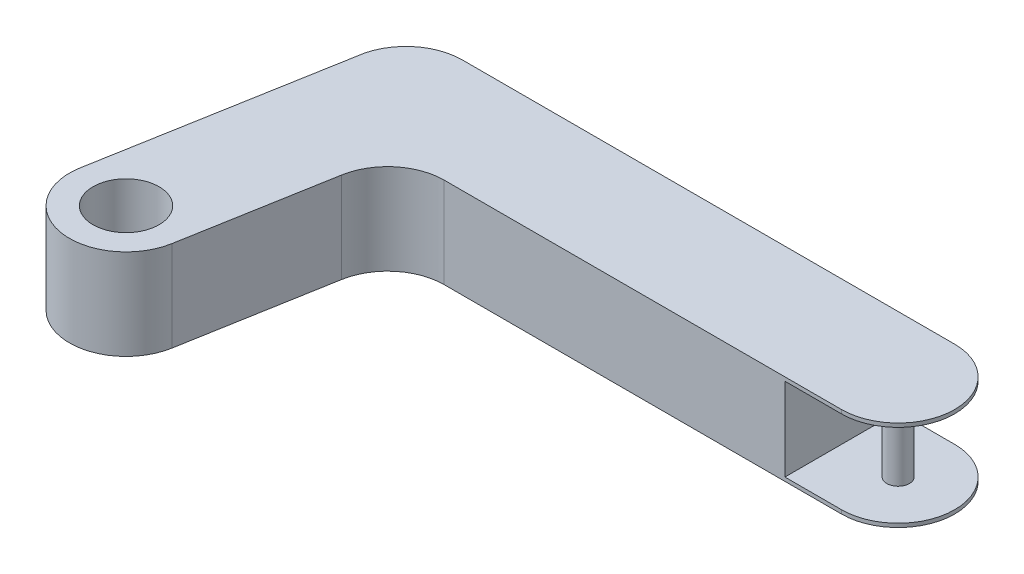
ISO-10303-21;
HEADER;
FILE_DESCRIPTION(('STEP AP214'),'2;1');
FILE_NAME('part.step','',(''),(''),'','','');
FILE_SCHEMA(('AUTOMOTIVE_DESIGN { 1 0 10303 214 1 1 1 1 }'));
ENDSEC;
DATA;
#1=APPLICATION_CONTEXT('core data for automotive mechanical design processes');
#2=APPLICATION_PROTOCOL_DEFINITION('international standard','automotive_design',2000,#1);
#3=PRODUCT_CONTEXT('',#1,'mechanical');
#4=PRODUCT('Part','Part','',(#3));
#5=PRODUCT_RELATED_PRODUCT_CATEGORY('part','',(#4));
#6=PRODUCT_DEFINITION_FORMATION('','',#4);
#7=PRODUCT_DEFINITION_CONTEXT('part definition',#1,'design');
#8=PRODUCT_DEFINITION('design','',#6,#7);
#9=PRODUCT_DEFINITION_SHAPE('','',#8);
#10=(LENGTH_UNIT() NAMED_UNIT(*) SI_UNIT(.MILLI.,.METRE.));
#11=(NAMED_UNIT(*) PLANE_ANGLE_UNIT() SI_UNIT($,.RADIAN.));
#12=(NAMED_UNIT(*) SI_UNIT($,.STERADIAN.) SOLID_ANGLE_UNIT());
#13=UNCERTAINTY_MEASURE_WITH_UNIT(LENGTH_MEASURE(1.E-05),#10,'distance_accuracy_value','');
#14=(GEOMETRIC_REPRESENTATION_CONTEXT(3) GLOBAL_UNCERTAINTY_ASSIGNED_CONTEXT((#13)) GLOBAL_UNIT_ASSIGNED_CONTEXT((#10,
#11,#12)) REPRESENTATION_CONTEXT('',''));
#15=CARTESIAN_POINT('',(0.,0.,0.));
#16=DIRECTION('',(0.,0.,1.));
#17=DIRECTION('',(1.,0.,0.));
#18=AXIS2_PLACEMENT_3D('',#15,#16,#17);
#19=CARTESIAN_POINT('',(359.662846673892,-30.48,-160.132216378943));
#20=DIRECTION('',(0.,1.,0.));
#21=DIRECTION('',(0.,0.,1.));
#22=AXIS2_PLACEMENT_3D('',#19,#20,#21);
#23=CYLINDRICAL_SURFACE('',#22,38.1);
#24=CARTESIAN_POINT('',(359.662846673892,-27.94,-160.132216378943));
#25=DIRECTION('',(0.,-1.,0.));
#26=DIRECTION('',(1.,0.,0.));
#27=AXIS2_PLACEMENT_3D('',#24,#25,#26);
#28=CIRCLE('',#27,38.1);
#29=CARTESIAN_POINT('',(359.662846673892,-27.94,-122.032216378943));
#30=VERTEX_POINT('',#29);
#31=CARTESIAN_POINT('',(359.662846673892,-27.94,-198.232216378943));
#32=VERTEX_POINT('',#31);
#33=EDGE_CURVE('E161',#30,#32,#28,.F.);
#34=ORIENTED_EDGE('',*,*,#33,.F.);
#35=DIRECTION('',(0.,1.,0.));
#36=VECTOR('',#35,1.);
#37=CARTESIAN_POINT('',(359.662846673892,-30.48,-122.032216378943));
#38=LINE('',#37,#36);
#39=CARTESIAN_POINT('',(359.662846673892,-30.48,-122.032216378943));
#40=VERTEX_POINT('',#39);
#41=EDGE_CURVE('E148',#40,#30,#38,.T.);
#42=ORIENTED_EDGE('',*,*,#41,.F.);
#43=CARTESIAN_POINT('',(359.662846673892,-30.48,-160.132216378943));
#44=DIRECTION('',(0.,1.,0.));
#45=DIRECTION('',(0.,0.,1.));
#46=AXIS2_PLACEMENT_3D('',#43,#44,#45);
#47=CIRCLE('',#46,38.1);
#48=CARTESIAN_POINT('',(359.662846673892,-30.48,-198.232216378943));
#49=VERTEX_POINT('',#48);
#50=EDGE_CURVE('E197',#40,#49,#47,.T.);
#51=ORIENTED_EDGE('',*,*,#50,.T.);
#52=DIRECTION('',(0.,1.,0.));
#53=VECTOR('',#52,1.);
#54=CARTESIAN_POINT('',(359.662846673892,-30.48,-198.232216378943));
#55=LINE('',#54,#53);
#56=EDGE_CURVE('E223',#49,#32,#55,.T.);
#57=ORIENTED_EDGE('',*,*,#56,.T.);
#58=EDGE_LOOP('',(#34,#42,#51,#57));
#59=FACE_BOUND('',#58,.T.);
#60=ADVANCED_FACE('F36',(#59),#23,.T.);
#61=CARTESIAN_POINT('',(92.1750221239627,-30.48,-83.9322163789429));
#62=DIRECTION('',(0.,1.,0.));
#63=DIRECTION('',(0.,0.,1.));
#64=AXIS2_PLACEMENT_3D('',#61,#62,#63);
#65=CYLINDRICAL_SURFACE('',#64,38.1);
#66=DIRECTION('',(0.,1.,0.));
#67=VECTOR('',#66,1.);
#68=CARTESIAN_POINT('',(92.1750221239627,-30.48,-122.032216378943));
#69=LINE('',#68,#67);
#70=CARTESIAN_POINT('',(92.1750221239627,-30.48,-122.032216378943));
#71=VERTEX_POINT('',#70);
#72=CARTESIAN_POINT('',(92.1750221239627,30.48,-122.032216378943));
#73=VERTEX_POINT('',#72);
#74=EDGE_CURVE('E214',#71,#73,#69,.T.);
#75=ORIENTED_EDGE('',*,*,#74,.T.);
#76=CARTESIAN_POINT('',(92.1750221239627,30.48,-83.9322163789429));
#77=DIRECTION('',(0.,-1.,0.));
#78=DIRECTION('',(0.,0.,1.));
#79=AXIS2_PLACEMENT_3D('',#76,#77,#78);
#80=CIRCLE('',#79,38.1);
#81=CARTESIAN_POINT('',(54.6538467341976,30.48,-90.5482119480531));
#82=VERTEX_POINT('',#81);
#83=EDGE_CURVE('E166',#82,#73,#80,.T.);
#84=ORIENTED_EDGE('',*,*,#83,.F.);
#85=DIRECTION('',(0.,1.,0.));
#86=VECTOR('',#85,1.);
#87=CARTESIAN_POINT('',(54.6538467341976,-30.48,-90.5482119480531));
#88=LINE('',#87,#86);
#89=CARTESIAN_POINT('',(54.6538467341976,-30.48,-90.5482119480531));
#90=VERTEX_POINT('',#89);
#91=EDGE_CURVE('E11',#90,#82,#88,.T.);
#92=ORIENTED_EDGE('',*,*,#91,.F.);
#93=CARTESIAN_POINT('',(92.1750221239627,-30.48,-83.9322163789429));
#94=DIRECTION('',(0.,-1.,0.));
#95=DIRECTION('',(0.,0.,1.));
#96=AXIS2_PLACEMENT_3D('',#93,#94,#95);
#97=CIRCLE('',#96,38.1);
#98=EDGE_CURVE('E193',#90,#71,#97,.T.);
#99=ORIENTED_EDGE('',*,*,#98,.T.);
#100=EDGE_LOOP('',(#75,#84,#92,#99));
#101=FACE_BOUND('',#100,.T.);
#102=ADVANCED_FACE('F38',(#101),#65,.F.);
#103=CARTESIAN_POINT('',(37.5211753897651,-30.48,6.6159955691102));
#104=DIRECTION('',(0.984807753012207,0.,0.173648177666934));
#105=DIRECTION('',(0.173648177666934,0.,-0.984807753012207));
#106=AXIS2_PLACEMENT_3D('',#103,#104,#105);
#107=PLANE('',#106);
#108=ORIENTED_EDGE('',*,*,#91,.T.);
#109=DIRECTION('',(0.173648177666934,0.,-0.984807753012207));
#110=VECTOR('',#109,1.);
#111=CARTESIAN_POINT('',(37.5211753897651,30.48,6.6159955691102));
#112=LINE('',#111,#110);
#113=CARTESIAN_POINT('',(37.5211753897651,30.48,6.61599556911017));
#114=VERTEX_POINT('',#113);
#115=EDGE_CURVE('E187',#114,#82,#112,.T.);
#116=ORIENTED_EDGE('',*,*,#115,.F.);
#117=DIRECTION('',(0.,1.,0.));
#118=VECTOR('',#117,1.);
#119=CARTESIAN_POINT('',(37.5211753897651,-30.48,6.61599556911017));
#120=LINE('',#119,#118);
#121=CARTESIAN_POINT('',(37.5211753897651,-30.48,6.61599556911017));
#122=VERTEX_POINT('',#121);
#123=EDGE_CURVE('E45',#122,#114,#120,.T.);
#124=ORIENTED_EDGE('',*,*,#123,.F.);
#125=DIRECTION('',(0.173648177666934,0.,-0.984807753012207));
#126=VECTOR('',#125,1.);
#127=CARTESIAN_POINT('',(37.5211753897651,-30.48,6.6159955691102));
#128=LINE('',#127,#126);
#129=EDGE_CURVE('E212',#122,#90,#128,.T.);
#130=ORIENTED_EDGE('',*,*,#129,.T.);
#131=EDGE_LOOP('',(#108,#116,#124,#130));
#132=FACE_BOUND('',#131,.T.);
#133=ADVANCED_FACE('F253',(#132),#107,.T.);
#134=CARTESIAN_POINT('',(0.,-30.48,0.));
#135=DIRECTION('',(0.,1.,0.));
#136=DIRECTION('',(0.,0.,1.));
#137=AXIS2_PLACEMENT_3D('',#134,#135,#136);
#138=CYLINDRICAL_SURFACE('',#137,38.1);
#139=ORIENTED_EDGE('',*,*,#123,.T.);
#140=CARTESIAN_POINT('',(0.,30.48,0.));
#141=DIRECTION('',(0.,1.,0.));
#142=DIRECTION('',(0.,0.,1.));
#143=AXIS2_PLACEMENT_3D('',#140,#141,#142);
#144=CIRCLE('',#143,38.1);
#145=CARTESIAN_POINT('',(-37.516563910054,30.48,-6.64209548130927));
#146=VERTEX_POINT('',#145);
#147=EDGE_CURVE('E184',#146,#114,#144,.T.);
#148=ORIENTED_EDGE('',*,*,#147,.F.);
#149=DIRECTION('',(0.,1.,0.));
#150=VECTOR('',#149,1.);
#151=CARTESIAN_POINT('',(-37.516563910054,-30.48,-6.64209548130927));
#152=LINE('',#151,#150);
#153=CARTESIAN_POINT('',(-37.516563910054,-30.48,-6.64209548130927));
#154=VERTEX_POINT('',#153);
#155=EDGE_CURVE('E217',#154,#146,#152,.T.);
#156=ORIENTED_EDGE('',*,*,#155,.F.);
#157=CARTESIAN_POINT('',(0.,-30.48,0.));
#158=DIRECTION('',(0.,1.,0.));
#159=DIRECTION('',(0.,0.,1.));
#160=AXIS2_PLACEMENT_3D('',#157,#158,#159);
#161=CIRCLE('',#160,38.1);
#162=EDGE_CURVE('E209',#154,#122,#161,.T.);
#163=ORIENTED_EDGE('',*,*,#162,.T.);
#164=EDGE_LOOP('',(#139,#148,#156,#163));
#165=FACE_BOUND('',#164,.T.);
#166=ADVANCED_FACE('F283',(#165),#138,.T.);
#167=CARTESIAN_POINT('',(-37.516563910054,-30.48,-6.64209548130927));
#168=DIRECTION('',(-0.984686716799319,0.,-0.174333214732527));
#169=DIRECTION('',(-0.174333214732527,0.,0.984686716799319));
#170=AXIS2_PLACEMENT_3D('',#167,#168,#169);
#171=PLANE('',#170);
#172=ORIENTED_EDGE('',*,*,#155,.T.);
#173=DIRECTION('',(-0.174333214732527,0.,0.984686716799319));
#174=VECTOR('',#173,1.);
#175=CARTESIAN_POINT('',(-37.516563910054,30.48,-6.64209548130927));
#176=LINE('',#175,#174);
#177=CARTESIAN_POINT('',(-8.65811343549267,30.48,-169.643350826196));
#178=VERTEX_POINT('',#177);
#179=EDGE_CURVE('E181',#178,#146,#176,.T.);
#180=ORIENTED_EDGE('',*,*,#179,.F.);
#181=DIRECTION('',(0.,1.,0.));
#182=VECTOR('',#181,1.);
#183=CARTESIAN_POINT('',(-8.65811343549267,-30.48,-169.643350826196));
#184=LINE('',#183,#182);
#185=CARTESIAN_POINT('',(-8.65811343549267,-30.48,-169.643350826196));
#186=VERTEX_POINT('',#185);
#187=EDGE_CURVE('E219',#186,#178,#184,.T.);
#188=ORIENTED_EDGE('',*,*,#187,.F.);
#189=DIRECTION('',(-0.174333214732527,0.,0.984686716799319));
#190=VECTOR('',#189,1.);
#191=CARTESIAN_POINT('',(-37.516563910054,-30.48,-6.64209548130927));
#192=LINE('',#191,#190);
#193=EDGE_CURVE('E206',#186,#154,#192,.T.);
#194=ORIENTED_EDGE('',*,*,#193,.T.);
#195=EDGE_LOOP('',(#172,#180,#188,#194));
#196=FACE_BOUND('',#195,.T.);
#197=ADVANCED_FACE('F277',(#196),#171,.T.);
#198=CARTESIAN_POINT('',(28.2356302282543,-30.48,-160.132216378943));
#199=DIRECTION('',(0.,1.,0.));
#200=DIRECTION('',(0.,0.,1.));
#201=AXIS2_PLACEMENT_3D('',#198,#199,#200);
#202=CYLINDRICAL_SURFACE('',#201,38.0999999999999);
#203=ORIENTED_EDGE('',*,*,#187,.T.);
#204=CARTESIAN_POINT('',(28.2356302282543,30.48,-160.132216378943));
#205=DIRECTION('',(0.,1.,0.));
#206=DIRECTION('',(0.,0.,1.));
#207=AXIS2_PLACEMENT_3D('',#204,#205,#206);
#208=CIRCLE('',#207,38.0999999999999);
#209=CARTESIAN_POINT('',(28.2356302282543,30.48,-198.232216378943));
#210=VERTEX_POINT('',#209);
#211=EDGE_CURVE('E178',#210,#178,#208,.T.);
#212=ORIENTED_EDGE('',*,*,#211,.F.);
#213=DIRECTION('',(0.,1.,0.));
#214=VECTOR('',#213,1.);
#215=CARTESIAN_POINT('',(28.2356302282543,-30.48,-198.232216378943));
#216=LINE('',#215,#214);
#217=CARTESIAN_POINT('',(28.2356302282543,-30.48,-198.232216378943));
#218=VERTEX_POINT('',#217);
#219=EDGE_CURVE('E221',#218,#210,#216,.T.);
#220=ORIENTED_EDGE('',*,*,#219,.F.);
#221=CARTESIAN_POINT('',(28.2356302282543,-30.48,-160.132216378943));
#222=DIRECTION('',(0.,1.,0.));
#223=DIRECTION('',(0.,0.,1.));
#224=AXIS2_PLACEMENT_3D('',#221,#222,#223);
#225=CIRCLE('',#224,38.0999999999999);
#226=EDGE_CURVE('E203',#218,#186,#225,.T.);
#227=ORIENTED_EDGE('',*,*,#226,.T.);
#228=EDGE_LOOP('',(#203,#212,#220,#227));
#229=FACE_BOUND('',#228,.T.);
#230=ADVANCED_FACE('F263',(#229),#202,.T.);
#231=CARTESIAN_POINT('',(359.662846673892,-30.48,-198.232216378943));
#232=DIRECTION('',(0.,0.,-1.));
#233=DIRECTION('',(-1.,0.,0.));
#234=AXIS2_PLACEMENT_3D('',#231,#232,#233);
#235=PLANE('',#234);
#236=DIRECTION('',(-1.,0.,0.));
#237=VECTOR('',#236,1.);
#238=CARTESIAN_POINT('',(321.562846673892,-27.94,-198.232216378943));
#239=LINE('',#238,#237);
#240=CARTESIAN_POINT('',(321.562846673892,-27.94,-198.232216378943));
#241=VERTEX_POINT('',#240);
#242=EDGE_CURVE('E144',#32,#241,#239,.T.);
#243=ORIENTED_EDGE('',*,*,#242,.F.);
#244=ORIENTED_EDGE('',*,*,#56,.F.);
#245=DIRECTION('',(-1.,0.,0.));
#246=VECTOR('',#245,1.);
#247=CARTESIAN_POINT('',(359.662846673892,-30.48,-198.232216378943));
#248=LINE('',#247,#246);
#249=EDGE_CURVE('E200',#49,#218,#248,.T.);
#250=ORIENTED_EDGE('',*,*,#249,.T.);
#251=ORIENTED_EDGE('',*,*,#219,.T.);
#252=DIRECTION('',(-1.,0.,0.));
#253=VECTOR('',#252,1.);
#254=CARTESIAN_POINT('',(359.662846673892,30.48,-198.232216378943));
#255=LINE('',#254,#253);
#256=CARTESIAN_POINT('',(359.662846673892,30.48,-198.232216378943));
#257=VERTEX_POINT('',#256);
#258=EDGE_CURVE('E175',#257,#210,#255,.T.);
#259=ORIENTED_EDGE('',*,*,#258,.F.);
#260=CARTESIAN_POINT('',(359.662846673892,27.94,-198.232216378943));
#261=VERTEX_POINT('',#260);
#262=EDGE_CURVE('E226',#261,#257,#55,.T.);
#263=ORIENTED_EDGE('',*,*,#262,.F.);
#264=DIRECTION('',(1.,0.,0.));
#265=VECTOR('',#264,1.);
#266=CARTESIAN_POINT('',(397.762846673892,27.94,-198.232216378943));
#267=LINE('',#266,#265);
#268=CARTESIAN_POINT('',(321.562846673892,27.94,-198.232216378943));
#269=VERTEX_POINT('',#268);
#270=EDGE_CURVE('E149',#269,#261,#267,.T.);
#271=ORIENTED_EDGE('',*,*,#270,.F.);
#272=DIRECTION('',(0.,1.,0.));
#273=VECTOR('',#272,1.);
#274=CARTESIAN_POINT('',(321.562846673892,27.94,-198.232216378943));
#275=LINE('',#274,#273);
#276=EDGE_CURVE('E151',#241,#269,#275,.T.);
#277=ORIENTED_EDGE('',*,*,#276,.F.);
#278=EDGE_LOOP('',(#243,#244,#250,#251,#259,#263,#271,#277));
#279=FACE_BOUND('',#278,.T.);
#280=ADVANCED_FACE('F256',(#279),#235,.T.);
#281=CARTESIAN_POINT('',(359.662846673892,27.94,-160.132216378943));
#282=DIRECTION('',(0.,1.,0.));
#283=DIRECTION('',(0.,0.,1.));
#284=AXIS2_PLACEMENT_3D('',#281,#282,#283);
#285=CIRCLE('',#284,38.1);
#286=CARTESIAN_POINT('',(359.662846673892,27.94,-122.032216378943));
#287=VERTEX_POINT('',#286);
#288=EDGE_CURVE('E53',#261,#287,#285,.F.);
#289=ORIENTED_EDGE('',*,*,#288,.F.);
#290=ORIENTED_EDGE('',*,*,#262,.T.);
#291=CARTESIAN_POINT('',(359.662846673892,30.48,-160.132216378943));
#292=DIRECTION('',(0.,1.,0.));
#293=DIRECTION('',(0.,0.,1.));
#294=AXIS2_PLACEMENT_3D('',#291,#292,#293);
#295=CIRCLE('',#294,38.1);
#296=CARTESIAN_POINT('',(359.662846673892,30.48,-122.032216378943));
#297=VERTEX_POINT('',#296);
#298=EDGE_CURVE('E172',#297,#257,#295,.T.);
#299=ORIENTED_EDGE('',*,*,#298,.F.);
#300=EDGE_CURVE('E228',#287,#297,#38,.T.);
#301=ORIENTED_EDGE('',*,*,#300,.F.);
#302=EDGE_LOOP('',(#289,#290,#299,#301));
#303=FACE_BOUND('',#302,.T.);
#304=ADVANCED_FACE('F249',(#303),#23,.T.);
#305=CARTESIAN_POINT('',(359.662846673892,-30.48,-122.032216378943));
#306=DIRECTION('',(0.,0.,1.));
#307=DIRECTION('',(1.,0.,0.));
#308=AXIS2_PLACEMENT_3D('',#305,#306,#307);
#309=PLANE('',#308);
#310=DIRECTION('',(-1.,0.,0.));
#311=VECTOR('',#310,1.);
#312=CARTESIAN_POINT('',(321.562846673892,-27.94,-122.032216378943));
#313=LINE('',#312,#311);
#314=CARTESIAN_POINT('',(321.562846673892,-27.94,-122.032216378943));
#315=VERTEX_POINT('',#314);
#316=EDGE_CURVE('E141',#30,#315,#313,.T.);
#317=ORIENTED_EDGE('',*,*,#316,.T.);
#318=DIRECTION('',(0.,1.,0.));
#319=VECTOR('',#318,1.);
#320=CARTESIAN_POINT('',(321.562846673892,27.94,-122.032216378943));
#321=LINE('',#320,#319);
#322=CARTESIAN_POINT('',(321.562846673892,27.94,-122.032216378943));
#323=VERTEX_POINT('',#322);
#324=EDGE_CURVE('E127',#315,#323,#321,.T.);
#325=ORIENTED_EDGE('',*,*,#324,.T.);
#326=DIRECTION('',(1.,0.,0.));
#327=VECTOR('',#326,1.);
#328=CARTESIAN_POINT('',(397.762846673892,27.94,-122.032216378943));
#329=LINE('',#328,#327);
#330=EDGE_CURVE('E156',#323,#287,#329,.T.);
#331=ORIENTED_EDGE('',*,*,#330,.T.);
#332=ORIENTED_EDGE('',*,*,#300,.T.);
#333=DIRECTION('',(1.,0.,0.));
#334=VECTOR('',#333,1.);
#335=CARTESIAN_POINT('',(359.662846673892,30.48,-122.032216378943));
#336=LINE('',#335,#334);
#337=EDGE_CURVE('E169',#73,#297,#336,.T.);
#338=ORIENTED_EDGE('',*,*,#337,.F.);
#339=ORIENTED_EDGE('',*,*,#74,.F.);
#340=DIRECTION('',(1.,0.,0.));
#341=VECTOR('',#340,1.);
#342=CARTESIAN_POINT('',(359.662846673892,-30.48,-122.032216378943));
#343=LINE('',#342,#341);
#344=EDGE_CURVE('E195',#71,#40,#343,.T.);
#345=ORIENTED_EDGE('',*,*,#344,.T.);
#346=ORIENTED_EDGE('',*,*,#41,.T.);
#347=EDGE_LOOP('',(#317,#325,#331,#332,#338,#339,#345,#346));
#348=FACE_BOUND('',#347,.T.);
#349=ADVANCED_FACE('F146',(#348),#309,.T.);
#350=CARTESIAN_POINT('',(92.1750221239627,-30.48,-83.9322163789429));
#351=DIRECTION('',(0.,1.,0.));
#352=DIRECTION('',(0.,0.,1.));
#353=AXIS2_PLACEMENT_3D('',#350,#351,#352);
#354=PLANE('',#353);
#355=CARTESIAN_POINT('',(0.,-30.48,0.));
#356=DIRECTION('',(0.,1.,0.));
#357=DIRECTION('',(0.,0.,1.));
#358=AXIS2_PLACEMENT_3D('',#355,#356,#357);
#359=CIRCLE('',#358,22.225);
#360=CARTESIAN_POINT('',(0.,-30.48,22.225));
#361=VERTEX_POINT('',#360);
#362=EDGE_CURVE('E190',#361,#361,#359,.T.);
#363=ORIENTED_EDGE('',*,*,#362,.T.);
#364=EDGE_LOOP('',(#363));
#365=FACE_BOUND('',#364,.T.);
#366=ORIENTED_EDGE('',*,*,#98,.F.);
#367=ORIENTED_EDGE('',*,*,#129,.F.);
#368=ORIENTED_EDGE('',*,*,#162,.F.);
#369=ORIENTED_EDGE('',*,*,#193,.F.);
#370=ORIENTED_EDGE('',*,*,#226,.F.);
#371=ORIENTED_EDGE('',*,*,#249,.F.);
#372=ORIENTED_EDGE('',*,*,#50,.F.);
#373=ORIENTED_EDGE('',*,*,#344,.F.);
#374=EDGE_LOOP('',(#366,#367,#368,#369,#370,#371,#372,#373));
#375=FACE_BOUND('',#374,.T.);
#376=ADVANCED_FACE('F262',(#365,#375),#354,.F.);
#377=CARTESIAN_POINT('',(0.,-30.48,0.));
#378=DIRECTION('',(0.,1.,0.));
#379=DIRECTION('',(0.,0.,1.));
#380=AXIS2_PLACEMENT_3D('',#377,#378,#379);
#381=CYLINDRICAL_SURFACE('',#380,22.225);
#382=CARTESIAN_POINT('',(0.,30.48,0.));
#383=DIRECTION('',(0.,1.,0.));
#384=DIRECTION('',(0.,0.,1.));
#385=AXIS2_PLACEMENT_3D('',#382,#383,#384);
#386=CIRCLE('',#385,22.225);
#387=CARTESIAN_POINT('',(0.,30.48,22.225));
#388=VERTEX_POINT('',#387);
#389=EDGE_CURVE('E163',#388,#388,#386,.T.);
#390=CARTESIAN_POINT('',(0.,-30.48,22.225));
#391=CARTESIAN_POINT('',(0.,-29.845,22.225));
#392=CARTESIAN_POINT('',(0.,-29.21,22.225));
#393=CARTESIAN_POINT('',(0.,-27.94,22.225));
#394=CARTESIAN_POINT('',(0.,-27.305,22.225));
#395=CARTESIAN_POINT('',(0.,-26.035,22.225));
#396=CARTESIAN_POINT('',(0.,-25.4,22.225));
#397=CARTESIAN_POINT('',(0.,-24.13,22.225));
#398=CARTESIAN_POINT('',(0.,-23.495,22.225));
#399=CARTESIAN_POINT('',(0.,-22.225,22.225));
#400=CARTESIAN_POINT('',(0.,-21.59,22.225));
#401=CARTESIAN_POINT('',(0.,-20.32,22.225));
#402=CARTESIAN_POINT('',(0.,-19.685,22.225));
#403=CARTESIAN_POINT('',(0.,-18.415,22.225));
#404=CARTESIAN_POINT('',(0.,-17.78,22.225));
#405=CARTESIAN_POINT('',(0.,-16.51,22.225));
#406=CARTESIAN_POINT('',(0.,-15.875,22.225));
#407=CARTESIAN_POINT('',(0.,-14.605,22.225));
#408=CARTESIAN_POINT('',(0.,-13.97,22.225));
#409=CARTESIAN_POINT('',(0.,-12.7,22.225));
#410=CARTESIAN_POINT('',(0.,-12.065,22.225));
#411=CARTESIAN_POINT('',(0.,-10.795,22.225));
#412=CARTESIAN_POINT('',(0.,-10.16,22.225));
#413=CARTESIAN_POINT('',(0.,-8.89,22.225));
#414=CARTESIAN_POINT('',(0.,-8.255,22.225));
#415=CARTESIAN_POINT('',(0.,-6.985,22.225));
#416=CARTESIAN_POINT('',(0.,-6.35,22.225));
#417=CARTESIAN_POINT('',(0.,-5.08,22.225));
#418=CARTESIAN_POINT('',(0.,-4.445,22.225));
#419=CARTESIAN_POINT('',(0.,-3.175,22.225));
#420=CARTESIAN_POINT('',(0.,-2.54,22.225));
#421=CARTESIAN_POINT('',(0.,-1.27,22.225));
#422=CARTESIAN_POINT('',(0.,-0.635,22.225));
#423=CARTESIAN_POINT('',(0.,0.634999999999998,22.225));
#424=CARTESIAN_POINT('',(0.,1.27,22.225));
#425=CARTESIAN_POINT('',(0.,2.54,22.225));
#426=CARTESIAN_POINT('',(0.,3.175,22.225));
#427=CARTESIAN_POINT('',(0.,4.445,22.225));
#428=CARTESIAN_POINT('',(0.,5.07999999999999,22.225));
#429=CARTESIAN_POINT('',(0.,6.35,22.225));
#430=CARTESIAN_POINT('',(0.,6.985,22.225));
#431=CARTESIAN_POINT('',(0.,8.255,22.225));
#432=CARTESIAN_POINT('',(0.,8.89,22.225));
#433=CARTESIAN_POINT('',(0.,10.16,22.225));
#434=CARTESIAN_POINT('',(0.,10.795,22.225));
#435=CARTESIAN_POINT('',(0.,12.065,22.225));
#436=CARTESIAN_POINT('',(0.,12.7,22.225));
#437=CARTESIAN_POINT('',(0.,13.97,22.225));
#438=CARTESIAN_POINT('',(0.,14.605,22.225));
#439=CARTESIAN_POINT('',(0.,15.875,22.225));
#440=CARTESIAN_POINT('',(0.,16.51,22.225));
#441=CARTESIAN_POINT('',(0.,17.78,22.225));
#442=CARTESIAN_POINT('',(0.,18.415,22.225));
#443=CARTESIAN_POINT('',(0.,19.685,22.225));
#444=CARTESIAN_POINT('',(0.,20.32,22.225));
#445=CARTESIAN_POINT('',(0.,21.59,22.225));
#446=CARTESIAN_POINT('',(0.,22.225,22.225));
#447=CARTESIAN_POINT('',(0.,23.495,22.225));
#448=CARTESIAN_POINT('',(0.,24.13,22.225));
#449=CARTESIAN_POINT('',(0.,25.4,22.225));
#450=CARTESIAN_POINT('',(0.,26.035,22.225));
#451=CARTESIAN_POINT('',(0.,27.305,22.225));
#452=CARTESIAN_POINT('',(0.,27.94,22.225));
#453=CARTESIAN_POINT('',(0.,29.21,22.225));
#454=CARTESIAN_POINT('',(0.,29.845,22.225));
#455=CARTESIAN_POINT('',(0.,30.48,22.225));
#456=B_SPLINE_CURVE_WITH_KNOTS('',3,(#390,#391,#392,#393,#394,#395,#396,#397,#398,#399,#400,
#401,#402,#403,#404,#405,#406,#407,#408,#409,#410,#411,#412,#413,#414,#415,#416,#417,#418,#419,
#420,#421,#422,#423,#424,#425,#426,#427,#428,#429,#430,#431,#432,#433,#434,#435,#436,#437,#438,
#439,#440,#441,#442,#443,#444,#445,#446,#447,#448,#449,#450,#451,#452,#453,#454,#455),
.UNSPECIFIED.,.F.,.F.,(4,2,2,2,2,2,2,2,2,2,2,2,2,2,2,2,2,2,2,2,2,2,2,2,2,2,2,2,2,2,2,2,4),(0.,
1.905,3.81,5.715,7.62,9.525,11.43,13.335,15.24,17.145,19.05,20.955,22.86,24.765,26.67,28.575,
30.48,32.385,34.29,36.195,38.1,40.005,41.91,43.815,45.72,47.625,49.53,51.435,53.34,55.245,57.15,
59.055,60.96),.UNSPECIFIED.);
#457=EDGE_CURVE('BSEAM348',#361,#388,#456,.T.);
#458=ORIENTED_EDGE('',*,*,#362,.F.);
#459=ORIENTED_EDGE('',*,*,#389,.T.);
#460=ORIENTED_EDGE('',*,*,#457,.T.);
#461=ORIENTED_EDGE('',*,*,#457,.F.);
#462=EDGE_LOOP('',(#458,#460,#459,#461));
#463=FACE_BOUND('',#462,.T.);
#464=ADVANCED_FACE('F348',(#463),#381,.F.);
#465=CARTESIAN_POINT('',(92.1750221239627,30.48,-83.9322163789429));
#466=DIRECTION('',(0.,1.,0.));
#467=DIRECTION('',(0.,0.,1.));
#468=AXIS2_PLACEMENT_3D('',#465,#466,#467);
#469=PLANE('',#468);
#470=ORIENTED_EDGE('',*,*,#389,.F.);
#471=EDGE_LOOP('',(#470));
#472=FACE_BOUND('',#471,.T.);
#473=ORIENTED_EDGE('',*,*,#83,.T.);
#474=ORIENTED_EDGE('',*,*,#337,.T.);
#475=ORIENTED_EDGE('',*,*,#298,.T.);
#476=ORIENTED_EDGE('',*,*,#258,.T.);
#477=ORIENTED_EDGE('',*,*,#211,.T.);
#478=ORIENTED_EDGE('',*,*,#179,.T.);
#479=ORIENTED_EDGE('',*,*,#147,.T.);
#480=ORIENTED_EDGE('',*,*,#115,.T.);
#481=EDGE_LOOP('',(#473,#474,#475,#476,#477,#478,#479,#480));
#482=FACE_BOUND('',#481,.T.);
#483=ADVANCED_FACE('F243',(#472,#482),#469,.T.);
#484=CARTESIAN_POINT('',(321.562846673892,-27.94,-27.5387541712324));
#485=DIRECTION('',(0.,-1.,0.));
#486=DIRECTION('',(1.,0.,0.));
#487=AXIS2_PLACEMENT_3D('',#484,#485,#486);
#488=PLANE('',#487);
#489=ORIENTED_EDGE('',*,*,#33,.T.);
#490=ORIENTED_EDGE('',*,*,#242,.T.);
#491=DIRECTION('',(0.,0.,-1.));
#492=VECTOR('',#491,1.);
#493=CARTESIAN_POINT('',(321.562846673892,-27.94,-27.5387541712324));
#494=LINE('',#493,#492);
#495=EDGE_CURVE('E131',#315,#241,#494,.T.);
#496=ORIENTED_EDGE('',*,*,#495,.F.);
#497=ORIENTED_EDGE('',*,*,#316,.F.);
#498=EDGE_LOOP('',(#489,#490,#496,#497));
#499=FACE_BOUND('',#498,.T.);
#500=CARTESIAN_POINT('',(359.662846673892,-27.94,-160.132216378943));
#501=DIRECTION('',(0.,-1.,0.));
#502=DIRECTION('',(1.,0.,0.));
#503=AXIS2_PLACEMENT_3D('',#500,#501,#502);
#504=CIRCLE('',#503,7.62000000000003);
#505=CARTESIAN_POINT('',(367.282846673892,-27.94,-160.132216378943));
#506=VERTEX_POINT('',#505);
#507=EDGE_CURVE('E40',#506,#506,#504,.F.);
#508=ORIENTED_EDGE('',*,*,#507,.F.);
#509=EDGE_LOOP('',(#508));
#510=FACE_BOUND('',#509,.T.);
#511=ADVANCED_FACE('F139',(#499,#510),#488,.F.);
#512=CARTESIAN_POINT('',(397.762846673892,27.94,-27.5387541712324));
#513=DIRECTION('',(0.,1.,0.));
#514=DIRECTION('',(0.,0.,1.));
#515=AXIS2_PLACEMENT_3D('',#512,#513,#514);
#516=PLANE('',#515);
#517=ORIENTED_EDGE('',*,*,#288,.T.);
#518=ORIENTED_EDGE('',*,*,#330,.F.);
#519=DIRECTION('',(0.,0.,-1.));
#520=VECTOR('',#519,1.);
#521=CARTESIAN_POINT('',(321.562846673892,27.94,-27.5387541712324));
#522=LINE('',#521,#520);
#523=EDGE_CURVE('E133',#323,#269,#522,.T.);
#524=ORIENTED_EDGE('',*,*,#523,.T.);
#525=ORIENTED_EDGE('',*,*,#270,.T.);
#526=EDGE_LOOP('',(#517,#518,#524,#525));
#527=FACE_BOUND('',#526,.T.);
#528=CARTESIAN_POINT('',(359.662846673892,27.94,-160.132216378943));
#529=DIRECTION('',(0.,1.,0.));
#530=DIRECTION('',(0.,0.,1.));
#531=AXIS2_PLACEMENT_3D('',#528,#529,#530);
#532=CIRCLE('',#531,7.62000000000003);
#533=CARTESIAN_POINT('',(359.662846673892,27.94,-152.512216378943));
#534=VERTEX_POINT('',#533);
#535=EDGE_CURVE('E157',#534,#534,#532,.F.);
#536=ORIENTED_EDGE('',*,*,#535,.F.);
#537=EDGE_LOOP('',(#536));
#538=FACE_BOUND('',#537,.T.);
#539=ADVANCED_FACE('F235',(#527,#538),#516,.F.);
#540=CARTESIAN_POINT('',(321.562846673892,27.94,-27.5387541712324));
#541=DIRECTION('',(-1.,0.,0.));
#542=DIRECTION('',(0.,0.,1.));
#543=AXIS2_PLACEMENT_3D('',#540,#541,#542);
#544=PLANE('',#543);
#545=ORIENTED_EDGE('',*,*,#495,.T.);
#546=ORIENTED_EDGE('',*,*,#276,.T.);
#547=ORIENTED_EDGE('',*,*,#523,.F.);
#548=ORIENTED_EDGE('',*,*,#324,.F.);
#549=EDGE_LOOP('',(#545,#546,#547,#548));
#550=FACE_BOUND('',#549,.T.);
#551=ADVANCED_FACE('F129',(#550),#544,.F.);
#552=CARTESIAN_POINT('',(359.662846673892,52.032614690566,-160.132216378943));
#553=DIRECTION('',(0.,-1.,0.));
#554=DIRECTION('',(0.,0.,-1.));
#555=AXIS2_PLACEMENT_3D('',#552,#553,#554);
#556=CYLINDRICAL_SURFACE('',#555,7.62000000000003);
#557=ORIENTED_EDGE('',*,*,#535,.T.);
#558=EDGE_LOOP('',(#557));
#559=FACE_BOUND('',#558,.T.);
#560=ORIENTED_EDGE('',*,*,#507,.T.);
#561=EDGE_LOOP('',(#560));
#562=FACE_BOUND('',#561,.T.);
#563=ADVANCED_FACE('F232',(#559,#562),#556,.T.);
#564=CLOSED_SHELL('',(#60,#102,#133,#166,#197,#230,#280,#304,#349,#376,#464,#483,#511,#539,#551,#563));
#565=MANIFOLD_SOLID_BREP('B2',#564);
#566=ADVANCED_BREP_SHAPE_REPRESENTATION('',(#18,#565),#14);
#567=SHAPE_DEFINITION_REPRESENTATION(#9,#566);
ENDSEC;
END-ISO-10303-21;
